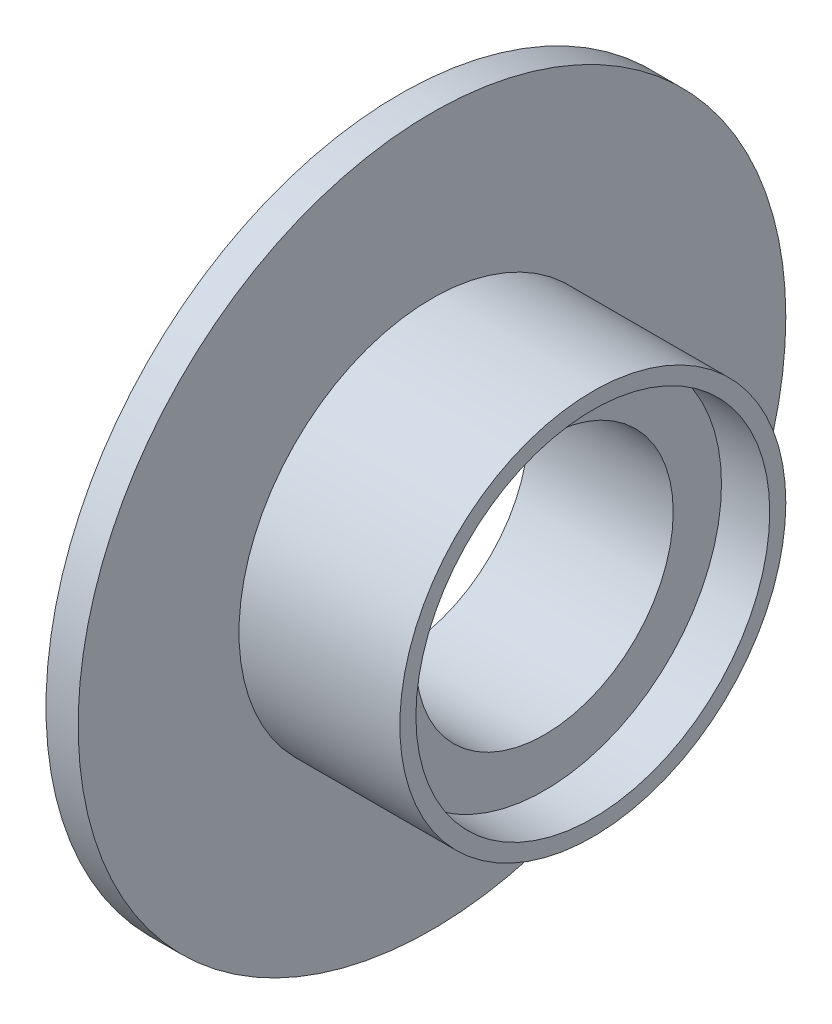
ISO-10303-21;
HEADER;
FILE_DESCRIPTION(('STEP AP214'),'2;1');
FILE_NAME('part.step','',(''),(''),'','','');
FILE_SCHEMA(('AUTOMOTIVE_DESIGN { 1 0 10303 214 1 1 1 1 }'));
ENDSEC;
DATA;
#1=APPLICATION_CONTEXT('core data for automotive mechanical design processes');
#2=APPLICATION_PROTOCOL_DEFINITION('international standard','automotive_design',2000,#1);
#3=PRODUCT_CONTEXT('',#1,'mechanical');
#4=PRODUCT('Part','Part','',(#3));
#5=PRODUCT_RELATED_PRODUCT_CATEGORY('part','',(#4));
#6=PRODUCT_DEFINITION_FORMATION('','',#4);
#7=PRODUCT_DEFINITION_CONTEXT('part definition',#1,'design');
#8=PRODUCT_DEFINITION('design','',#6,#7);
#9=PRODUCT_DEFINITION_SHAPE('','',#8);
#10=(LENGTH_UNIT() NAMED_UNIT(*) SI_UNIT(.MILLI.,.METRE.));
#11=(NAMED_UNIT(*) PLANE_ANGLE_UNIT() SI_UNIT($,.RADIAN.));
#12=(NAMED_UNIT(*) SI_UNIT($,.STERADIAN.) SOLID_ANGLE_UNIT());
#13=UNCERTAINTY_MEASURE_WITH_UNIT(LENGTH_MEASURE(1.E-05),#10,'distance_accuracy_value','');
#14=(GEOMETRIC_REPRESENTATION_CONTEXT(3) GLOBAL_UNCERTAINTY_ASSIGNED_CONTEXT((#13)) GLOBAL_UNIT_ASSIGNED_CONTEXT((#10,
#11,#12)) REPRESENTATION_CONTEXT('',''));
#15=CARTESIAN_POINT('',(0.,0.,0.));
#16=DIRECTION('',(0.,0.,1.));
#17=DIRECTION('',(1.,0.,0.));
#18=AXIS2_PLACEMENT_3D('',#15,#16,#17);
#19=CARTESIAN_POINT('',(0.,0.,0.));
#20=DIRECTION('',(-1.,0.,0.));
#21=DIRECTION('',(0.,0.,-1.));
#22=AXIS2_PLACEMENT_3D('',#19,#20,#21);
#23=CYLINDRICAL_SURFACE('',#22,22.);
#24=CARTESIAN_POINT('',(0.,0.,0.));
#25=DIRECTION('',(1.,0.,0.));
#26=DIRECTION('',(0.,0.,-1.));
#27=AXIS2_PLACEMENT_3D('',#24,#25,#26);
#28=CIRCLE('',#27,22.);
#29=CARTESIAN_POINT('',(0.,0.,-22.));
#30=VERTEX_POINT('',#29);
#31=EDGE_CURVE('E61',#30,#30,#28,.T.);
#32=ORIENTED_EDGE('',*,*,#31,.T.);
#33=EDGE_LOOP('',(#32));
#34=FACE_BOUND('',#33,.T.);
#35=CARTESIAN_POINT('',(2.,0.,0.));
#36=DIRECTION('',(1.,0.,0.));
#37=DIRECTION('',(0.,0.,-1.));
#38=AXIS2_PLACEMENT_3D('',#35,#36,#37);
#39=CIRCLE('',#38,22.);
#40=CARTESIAN_POINT('',(2.,0.,-22.));
#41=VERTEX_POINT('',#40);
#42=EDGE_CURVE('E10',#41,#41,#39,.T.);
#43=ORIENTED_EDGE('',*,*,#42,.F.);
#44=EDGE_LOOP('',(#43));
#45=FACE_BOUND('',#44,.T.);
#46=ADVANCED_FACE('F33',(#34,#45),#23,.T.);
#47=CARTESIAN_POINT('',(2.,0.,22.));
#48=DIRECTION('',(-1.,0.,0.));
#49=DIRECTION('',(0.,0.,-1.));
#50=AXIS2_PLACEMENT_3D('',#47,#48,#49);
#51=PLANE('',#50);
#52=ORIENTED_EDGE('',*,*,#42,.T.);
#53=EDGE_LOOP('',(#52));
#54=FACE_BOUND('',#53,.T.);
#55=CARTESIAN_POINT('',(2.,0.,0.));
#56=DIRECTION('',(1.,0.,0.));
#57=DIRECTION('',(0.,0.,-1.));
#58=AXIS2_PLACEMENT_3D('',#55,#56,#57);
#59=CIRCLE('',#58,12.);
#60=CARTESIAN_POINT('',(2.,0.,-12.));
#61=VERTEX_POINT('',#60);
#62=EDGE_CURVE('E39',#61,#61,#59,.T.);
#63=ORIENTED_EDGE('',*,*,#62,.F.);
#64=EDGE_LOOP('',(#63));
#65=FACE_BOUND('',#64,.T.);
#66=ADVANCED_FACE('F79',(#54,#65),#51,.F.);
#67=CARTESIAN_POINT('',(0.,0.,0.));
#68=DIRECTION('',(-1.,0.,0.));
#69=DIRECTION('',(0.,0.,-1.));
#70=AXIS2_PLACEMENT_3D('',#67,#68,#69);
#71=CYLINDRICAL_SURFACE('',#70,12.);
#72=ORIENTED_EDGE('',*,*,#62,.T.);
#73=EDGE_LOOP('',(#72));
#74=FACE_BOUND('',#73,.T.);
#75=CARTESIAN_POINT('',(12.,0.,0.));
#76=DIRECTION('',(1.,0.,0.));
#77=DIRECTION('',(0.,0.,-1.));
#78=AXIS2_PLACEMENT_3D('',#75,#76,#77);
#79=CIRCLE('',#78,12.);
#80=CARTESIAN_POINT('',(12.,0.,-12.));
#81=VERTEX_POINT('',#80);
#82=EDGE_CURVE('E43',#81,#81,#79,.T.);
#83=ORIENTED_EDGE('',*,*,#82,.F.);
#84=EDGE_LOOP('',(#83));
#85=FACE_BOUND('',#84,.T.);
#86=ADVANCED_FACE('F83',(#74,#85),#71,.T.);
#87=CARTESIAN_POINT('',(12.,0.,12.));
#88=DIRECTION('',(-1.,0.,0.));
#89=DIRECTION('',(0.,0.,-1.));
#90=AXIS2_PLACEMENT_3D('',#87,#88,#89);
#91=PLANE('',#90);
#92=ORIENTED_EDGE('',*,*,#82,.T.);
#93=EDGE_LOOP('',(#92));
#94=FACE_BOUND('',#93,.T.);
#95=CARTESIAN_POINT('',(12.,0.,0.));
#96=DIRECTION('',(1.,0.,0.));
#97=DIRECTION('',(0.,0.,-1.));
#98=AXIS2_PLACEMENT_3D('',#95,#96,#97);
#99=CIRCLE('',#98,11.);
#100=CARTESIAN_POINT('',(12.,0.,-11.));
#101=VERTEX_POINT('',#100);
#102=EDGE_CURVE('E47',#101,#101,#99,.T.);
#103=ORIENTED_EDGE('',*,*,#102,.F.);
#104=EDGE_LOOP('',(#103));
#105=FACE_BOUND('',#104,.T.);
#106=ADVANCED_FACE('F87',(#94,#105),#91,.F.);
#107=CARTESIAN_POINT('',(0.,0.,0.));
#108=DIRECTION('',(-1.,0.,0.));
#109=DIRECTION('',(0.,0.,-1.));
#110=AXIS2_PLACEMENT_3D('',#107,#108,#109);
#111=CYLINDRICAL_SURFACE('',#110,11.);
#112=ORIENTED_EDGE('',*,*,#102,.T.);
#113=EDGE_LOOP('',(#112));
#114=FACE_BOUND('',#113,.T.);
#115=CARTESIAN_POINT('',(9.,0.,0.));
#116=DIRECTION('',(1.,0.,0.));
#117=DIRECTION('',(0.,0.,-1.));
#118=AXIS2_PLACEMENT_3D('',#115,#116,#117);
#119=CIRCLE('',#118,11.);
#120=CARTESIAN_POINT('',(9.,0.,-11.));
#121=VERTEX_POINT('',#120);
#122=EDGE_CURVE('E52',#121,#121,#119,.T.);
#123=ORIENTED_EDGE('',*,*,#122,.F.);
#124=EDGE_LOOP('',(#123));
#125=FACE_BOUND('',#124,.T.);
#126=ADVANCED_FACE('F93',(#114,#125),#111,.F.);
#127=CARTESIAN_POINT('',(9.,0.,11.));
#128=DIRECTION('',(-1.,0.,0.));
#129=DIRECTION('',(0.,0.,-1.));
#130=AXIS2_PLACEMENT_3D('',#127,#128,#129);
#131=PLANE('',#130);
#132=ORIENTED_EDGE('',*,*,#122,.T.);
#133=EDGE_LOOP('',(#132));
#134=FACE_BOUND('',#133,.T.);
#135=CARTESIAN_POINT('',(9.,0.,0.));
#136=DIRECTION('',(1.,0.,0.));
#137=DIRECTION('',(0.,0.,-1.));
#138=AXIS2_PLACEMENT_3D('',#135,#136,#137);
#139=CIRCLE('',#138,8.);
#140=CARTESIAN_POINT('',(9.,0.,-8.));
#141=VERTEX_POINT('',#140);
#142=EDGE_CURVE('E55',#141,#141,#139,.T.);
#143=ORIENTED_EDGE('',*,*,#142,.F.);
#144=EDGE_LOOP('',(#143));
#145=FACE_BOUND('',#144,.T.);
#146=ADVANCED_FACE('F75',(#134,#145),#131,.F.);
#147=CARTESIAN_POINT('',(0.,0.,0.));
#148=DIRECTION('',(-1.,0.,0.));
#149=DIRECTION('',(0.,0.,-1.));
#150=AXIS2_PLACEMENT_3D('',#147,#148,#149);
#151=CYLINDRICAL_SURFACE('',#150,8.);
#152=ORIENTED_EDGE('',*,*,#142,.T.);
#153=EDGE_LOOP('',(#152));
#154=FACE_BOUND('',#153,.T.);
#155=CARTESIAN_POINT('',(0.,0.,0.));
#156=DIRECTION('',(1.,0.,0.));
#157=DIRECTION('',(0.,0.,-1.));
#158=AXIS2_PLACEMENT_3D('',#155,#156,#157);
#159=CIRCLE('',#158,8.);
#160=CARTESIAN_POINT('',(0.,0.,-8.));
#161=VERTEX_POINT('',#160);
#162=EDGE_CURVE('E58',#161,#161,#159,.T.);
#163=ORIENTED_EDGE('',*,*,#162,.F.);
#164=EDGE_LOOP('',(#163));
#165=FACE_BOUND('',#164,.T.);
#166=ADVANCED_FACE('F69',(#154,#165),#151,.F.);
#167=CARTESIAN_POINT('',(0.,0.,8.));
#168=DIRECTION('',(1.,0.,0.));
#169=DIRECTION('',(0.,0.,1.));
#170=AXIS2_PLACEMENT_3D('',#167,#168,#169);
#171=PLANE('',#170);
#172=ORIENTED_EDGE('',*,*,#162,.T.);
#173=EDGE_LOOP('',(#172));
#174=FACE_BOUND('',#173,.T.);
#175=ORIENTED_EDGE('',*,*,#31,.F.);
#176=EDGE_LOOP('',(#175));
#177=FACE_BOUND('',#176,.T.);
#178=ADVANCED_FACE('F67',(#174,#177),#171,.F.);
#179=CLOSED_SHELL('',(#46,#66,#86,#106,#126,#146,#166,#178));
#180=MANIFOLD_SOLID_BREP('B2',#179);
#181=ADVANCED_BREP_SHAPE_REPRESENTATION('',(#18,#180),#14);
#182=SHAPE_DEFINITION_REPRESENTATION(#9,#181);
ENDSEC;
END-ISO-10303-21;
